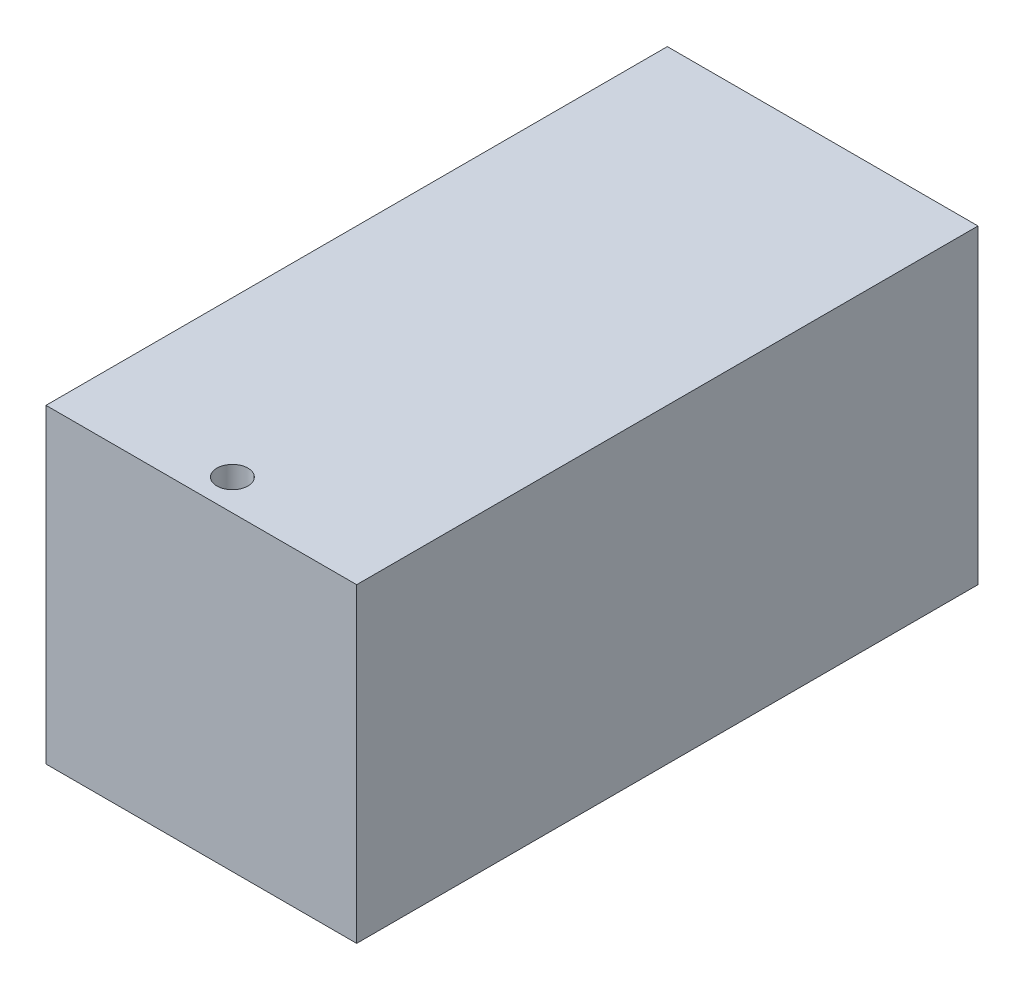
ISO-10303-21;
HEADER;
FILE_DESCRIPTION(('STEP AP214'),'2;1');
FILE_NAME('part.step','',(''),(''),'','','');
FILE_SCHEMA(('AUTOMOTIVE_DESIGN { 1 0 10303 214 1 1 1 1 }'));
ENDSEC;
DATA;
#1=APPLICATION_CONTEXT('core data for automotive mechanical design processes');
#2=APPLICATION_PROTOCOL_DEFINITION('international standard','automotive_design',2000,#1);
#3=PRODUCT_CONTEXT('',#1,'mechanical');
#4=PRODUCT('Part','Part','',(#3));
#5=PRODUCT_RELATED_PRODUCT_CATEGORY('part','',(#4));
#6=PRODUCT_DEFINITION_FORMATION('','',#4);
#7=PRODUCT_DEFINITION_CONTEXT('part definition',#1,'design');
#8=PRODUCT_DEFINITION('design','',#6,#7);
#9=PRODUCT_DEFINITION_SHAPE('','',#8);
#10=(LENGTH_UNIT() NAMED_UNIT(*) SI_UNIT(.MILLI.,.METRE.));
#11=(NAMED_UNIT(*) PLANE_ANGLE_UNIT() SI_UNIT($,.RADIAN.));
#12=(NAMED_UNIT(*) SI_UNIT($,.STERADIAN.) SOLID_ANGLE_UNIT());
#13=UNCERTAINTY_MEASURE_WITH_UNIT(LENGTH_MEASURE(1.E-05),#10,'distance_accuracy_value','');
#14=(GEOMETRIC_REPRESENTATION_CONTEXT(3) GLOBAL_UNCERTAINTY_ASSIGNED_CONTEXT((#13)) GLOBAL_UNIT_ASSIGNED_CONTEXT((#10,
#11,#12)) REPRESENTATION_CONTEXT('',''));
#15=CARTESIAN_POINT('',(0.,0.,0.));
#16=DIRECTION('',(0.,0.,1.));
#17=DIRECTION('',(1.,0.,0.));
#18=AXIS2_PLACEMENT_3D('',#15,#16,#17);
#19=CARTESIAN_POINT('',(0.,0.,100.));
#20=DIRECTION('',(1.,0.,0.));
#21=DIRECTION('',(0.,1.,0.));
#22=AXIS2_PLACEMENT_3D('',#19,#20,#21);
#23=PLANE('',#22);
#24=DIRECTION('',(0.,-1.,0.));
#25=VECTOR('',#24,1.);
#26=CARTESIAN_POINT('',(0.,0.,0.));
#27=LINE('',#26,#25);
#28=CARTESIAN_POINT('',(0.,0.,0.));
#29=VERTEX_POINT('',#28);
#30=CARTESIAN_POINT('',(0.,-50.,0.));
#31=VERTEX_POINT('',#30);
#32=EDGE_CURVE('E99',#29,#31,#27,.T.);
#33=ORIENTED_EDGE('',*,*,#32,.T.);
#34=DIRECTION('',(0.,0.,-1.));
#35=VECTOR('',#34,1.);
#36=CARTESIAN_POINT('',(0.,-50.,100.));
#37=LINE('',#36,#35);
#38=CARTESIAN_POINT('',(0.,-50.,100.));
#39=VERTEX_POINT('',#38);
#40=EDGE_CURVE('E11',#39,#31,#37,.T.);
#41=ORIENTED_EDGE('',*,*,#40,.F.);
#42=DIRECTION('',(0.,-1.,0.));
#43=VECTOR('',#42,1.);
#44=CARTESIAN_POINT('',(0.,0.,100.));
#45=LINE('',#44,#43);
#46=CARTESIAN_POINT('',(0.,0.,100.));
#47=VERTEX_POINT('',#46);
#48=EDGE_CURVE('E87',#47,#39,#45,.T.);
#49=ORIENTED_EDGE('',*,*,#48,.F.);
#50=DIRECTION('',(0.,0.,-1.));
#51=VECTOR('',#50,1.);
#52=CARTESIAN_POINT('',(0.,0.,100.));
#53=LINE('',#52,#51);
#54=EDGE_CURVE('E95',#47,#29,#53,.T.);
#55=ORIENTED_EDGE('',*,*,#54,.T.);
#56=EDGE_LOOP('',(#33,#41,#49,#55));
#57=FACE_BOUND('',#56,.T.);
#58=ADVANCED_FACE('F36',(#57),#23,.F.);
#59=CARTESIAN_POINT('',(0.,-50.,100.));
#60=DIRECTION('',(0.,1.,0.));
#61=DIRECTION('',(0.,0.,1.));
#62=AXIS2_PLACEMENT_3D('',#59,#60,#61);
#63=PLANE('',#62);
#64=CARTESIAN_POINT('',(25.,-50.,95.));
#65=DIRECTION('',(0.,1.,0.));
#66=DIRECTION('',(0.,0.,1.));
#67=AXIS2_PLACEMENT_3D('',#64,#65,#66);
#68=CIRCLE('',#67,2.5);
#69=CARTESIAN_POINT('',(25.,-50.,97.5));
#70=VERTEX_POINT('',#69);
#71=EDGE_CURVE('E102',#70,#70,#68,.T.);
#72=ORIENTED_EDGE('',*,*,#71,.T.);
#73=EDGE_LOOP('',(#72));
#74=FACE_BOUND('',#73,.T.);
#75=DIRECTION('',(1.,0.,0.));
#76=VECTOR('',#75,1.);
#77=CARTESIAN_POINT('',(0.,-50.,0.));
#78=LINE('',#77,#76);
#79=CARTESIAN_POINT('',(50.,-50.,0.));
#80=VERTEX_POINT('',#79);
#81=EDGE_CURVE('E91',#31,#80,#78,.T.);
#82=ORIENTED_EDGE('',*,*,#81,.T.);
#83=DIRECTION('',(0.,0.,-1.));
#84=VECTOR('',#83,1.);
#85=CARTESIAN_POINT('',(50.,-50.,100.));
#86=LINE('',#85,#84);
#87=CARTESIAN_POINT('',(50.,-50.,100.));
#88=VERTEX_POINT('',#87);
#89=EDGE_CURVE('E44',#88,#80,#86,.T.);
#90=ORIENTED_EDGE('',*,*,#89,.F.);
#91=DIRECTION('',(1.,0.,0.));
#92=VECTOR('',#91,1.);
#93=CARTESIAN_POINT('',(0.,-50.,100.));
#94=LINE('',#93,#92);
#95=EDGE_CURVE('E82',#39,#88,#94,.T.);
#96=ORIENTED_EDGE('',*,*,#95,.F.);
#97=ORIENTED_EDGE('',*,*,#40,.T.);
#98=EDGE_LOOP('',(#82,#90,#96,#97));
#99=FACE_BOUND('',#98,.T.);
#100=ADVANCED_FACE('F90',(#74,#99),#63,.F.);
#101=CARTESIAN_POINT('',(50.,0.,100.));
#102=DIRECTION('',(-1.,0.,0.));
#103=DIRECTION('',(0.,0.,1.));
#104=AXIS2_PLACEMENT_3D('',#101,#102,#103);
#105=PLANE('',#104);
#106=DIRECTION('',(0.,1.,0.));
#107=VECTOR('',#106,1.);
#108=CARTESIAN_POINT('',(50.,0.,0.));
#109=LINE('',#108,#107);
#110=CARTESIAN_POINT('',(50.,0.,0.));
#111=VERTEX_POINT('',#110);
#112=EDGE_CURVE('E69',#80,#111,#109,.T.);
#113=ORIENTED_EDGE('',*,*,#112,.T.);
#114=DIRECTION('',(0.,0.,-1.));
#115=VECTOR('',#114,1.);
#116=CARTESIAN_POINT('',(50.,0.,100.));
#117=LINE('',#116,#115);
#118=CARTESIAN_POINT('',(50.,0.,100.));
#119=VERTEX_POINT('',#118);
#120=EDGE_CURVE('E92',#119,#111,#117,.T.);
#121=ORIENTED_EDGE('',*,*,#120,.F.);
#122=DIRECTION('',(0.,1.,0.));
#123=VECTOR('',#122,1.);
#124=CARTESIAN_POINT('',(50.,0.,100.));
#125=LINE('',#124,#123);
#126=EDGE_CURVE('E85',#88,#119,#125,.T.);
#127=ORIENTED_EDGE('',*,*,#126,.F.);
#128=ORIENTED_EDGE('',*,*,#89,.T.);
#129=EDGE_LOOP('',(#113,#121,#127,#128));
#130=FACE_BOUND('',#129,.T.);
#131=ADVANCED_FACE('F93',(#130),#105,.F.);
#132=CARTESIAN_POINT('',(0.,0.,100.));
#133=DIRECTION('',(0.,-1.,0.));
#134=DIRECTION('',(0.,0.,-1.));
#135=AXIS2_PLACEMENT_3D('',#132,#133,#134);
#136=PLANE('',#135);
#137=CARTESIAN_POINT('',(25.,0.,95.));
#138=DIRECTION('',(0.,1.,0.));
#139=DIRECTION('',(0.,0.,1.));
#140=AXIS2_PLACEMENT_3D('',#137,#138,#139);
#141=CIRCLE('',#140,2.5);
#142=CARTESIAN_POINT('',(25.,0.,97.5));
#143=VERTEX_POINT('',#142);
#144=EDGE_CURVE('E113',#143,#143,#141,.T.);
#145=ORIENTED_EDGE('',*,*,#144,.F.);
#146=EDGE_LOOP('',(#145));
#147=FACE_BOUND('',#146,.T.);
#148=DIRECTION('',(-1.,0.,0.));
#149=VECTOR('',#148,1.);
#150=CARTESIAN_POINT('',(0.,0.,0.));
#151=LINE('',#150,#149);
#152=EDGE_CURVE('E75',#111,#29,#151,.T.);
#153=ORIENTED_EDGE('',*,*,#152,.T.);
#154=ORIENTED_EDGE('',*,*,#54,.F.);
#155=DIRECTION('',(-1.,0.,0.));
#156=VECTOR('',#155,1.);
#157=CARTESIAN_POINT('',(0.,0.,100.));
#158=LINE('',#157,#156);
#159=EDGE_CURVE('E52',#119,#47,#158,.T.);
#160=ORIENTED_EDGE('',*,*,#159,.F.);
#161=ORIENTED_EDGE('',*,*,#120,.T.);
#162=EDGE_LOOP('',(#153,#154,#160,#161));
#163=FACE_BOUND('',#162,.T.);
#164=ADVANCED_FACE('F107',(#147,#163),#136,.F.);
#165=CARTESIAN_POINT('',(0.,0.,100.));
#166=DIRECTION('',(0.,0.,1.));
#167=DIRECTION('',(1.,0.,0.));
#168=AXIS2_PLACEMENT_3D('',#165,#166,#167);
#169=PLANE('',#168);
#170=ORIENTED_EDGE('',*,*,#48,.T.);
#171=ORIENTED_EDGE('',*,*,#95,.T.);
#172=ORIENTED_EDGE('',*,*,#126,.T.);
#173=ORIENTED_EDGE('',*,*,#159,.T.);
#174=EDGE_LOOP('',(#170,#171,#172,#173));
#175=FACE_BOUND('',#174,.T.);
#176=ADVANCED_FACE('F83',(#175),#169,.T.);
#177=CARTESIAN_POINT('',(0.,0.,0.));
#178=DIRECTION('',(0.,0.,1.));
#179=DIRECTION('',(1.,0.,0.));
#180=AXIS2_PLACEMENT_3D('',#177,#178,#179);
#181=PLANE('',#180);
#182=ORIENTED_EDGE('',*,*,#32,.F.);
#183=ORIENTED_EDGE('',*,*,#152,.F.);
#184=ORIENTED_EDGE('',*,*,#112,.F.);
#185=ORIENTED_EDGE('',*,*,#81,.F.);
#186=EDGE_LOOP('',(#182,#183,#184,#185));
#187=FACE_BOUND('',#186,.T.);
#188=ADVANCED_FACE('F110',(#187),#181,.F.);
#189=CARTESIAN_POINT('',(25.,-50.,95.));
#190=DIRECTION('',(0.,1.,0.));
#191=DIRECTION('',(0.,0.,1.));
#192=AXIS2_PLACEMENT_3D('',#189,#190,#191);
#193=CYLINDRICAL_SURFACE('',#192,2.5);
#194=ORIENTED_EDGE('',*,*,#71,.F.);
#195=EDGE_LOOP('',(#194));
#196=FACE_BOUND('',#195,.T.);
#197=ORIENTED_EDGE('',*,*,#144,.T.);
#198=EDGE_LOOP('',(#197));
#199=FACE_BOUND('',#198,.T.);
#200=ADVANCED_FACE('F120',(#196,#199),#193,.F.);
#201=CLOSED_SHELL('',(#58,#100,#131,#164,#176,#188,#200));
#202=MANIFOLD_SOLID_BREP('B2',#201);
#203=ADVANCED_BREP_SHAPE_REPRESENTATION('',(#18,#202),#14);
#204=SHAPE_DEFINITION_REPRESENTATION(#9,#203);
ENDSEC;
END-ISO-10303-21;
